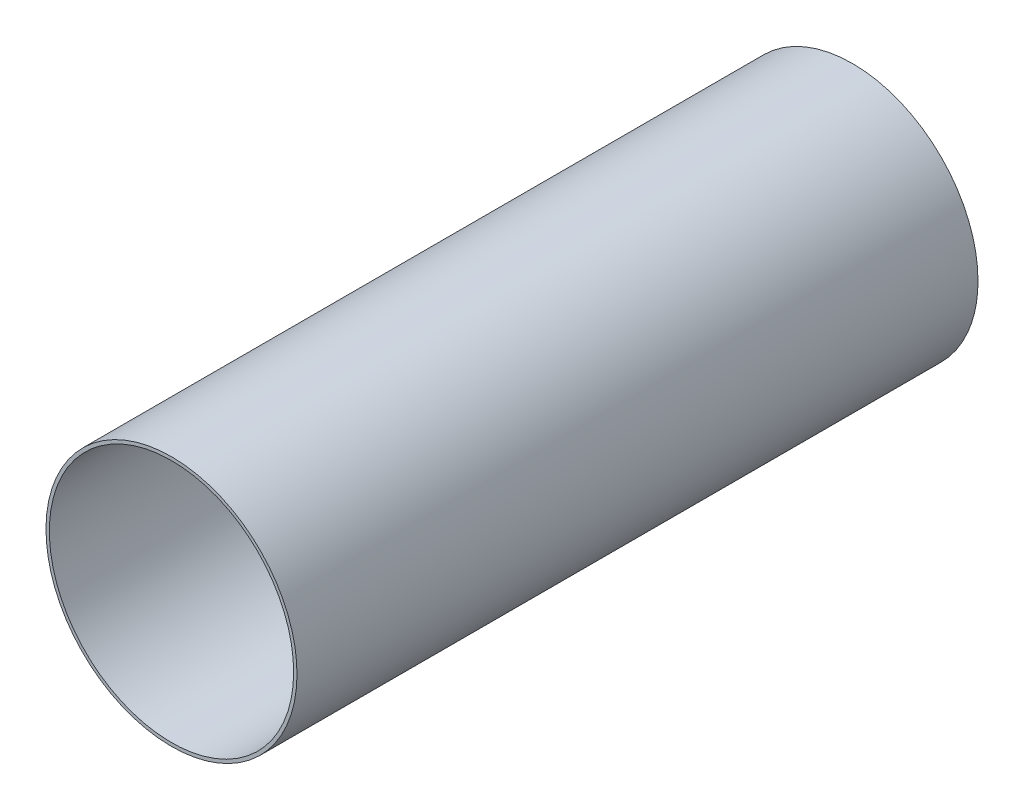
ISO-10303-21;
HEADER;
FILE_DESCRIPTION(('STEP AP214'),'2;1');
FILE_NAME('part.step','',(''),(''),'','','');
FILE_SCHEMA(('AUTOMOTIVE_DESIGN { 1 0 10303 214 1 1 1 1 }'));
ENDSEC;
DATA;
#1=APPLICATION_CONTEXT('core data for automotive mechanical design processes');
#2=APPLICATION_PROTOCOL_DEFINITION('international standard','automotive_design',2000,#1);
#3=PRODUCT_CONTEXT('',#1,'mechanical');
#4=PRODUCT('Part','Part','',(#3));
#5=PRODUCT_RELATED_PRODUCT_CATEGORY('part','',(#4));
#6=PRODUCT_DEFINITION_FORMATION('','',#4);
#7=PRODUCT_DEFINITION_CONTEXT('part definition',#1,'design');
#8=PRODUCT_DEFINITION('design','',#6,#7);
#9=PRODUCT_DEFINITION_SHAPE('','',#8);
#10=(LENGTH_UNIT() NAMED_UNIT(*) SI_UNIT(.MILLI.,.METRE.));
#11=(NAMED_UNIT(*) PLANE_ANGLE_UNIT() SI_UNIT($,.RADIAN.));
#12=(NAMED_UNIT(*) SI_UNIT($,.STERADIAN.) SOLID_ANGLE_UNIT());
#13=UNCERTAINTY_MEASURE_WITH_UNIT(LENGTH_MEASURE(1.E-05),#10,'distance_accuracy_value','');
#14=(GEOMETRIC_REPRESENTATION_CONTEXT(3) GLOBAL_UNCERTAINTY_ASSIGNED_CONTEXT((#13)) GLOBAL_UNIT_ASSIGNED_CONTEXT((#10,
#11,#12)) REPRESENTATION_CONTEXT('',''));
#15=CARTESIAN_POINT('',(0.,0.,0.));
#16=DIRECTION('',(0.,0.,1.));
#17=DIRECTION('',(1.,0.,0.));
#18=AXIS2_PLACEMENT_3D('',#15,#16,#17);
#19=CARTESIAN_POINT('',(0.,0.,0.));
#20=DIRECTION('',(0.,0.,1.));
#21=DIRECTION('',(1.,0.,0.));
#22=AXIS2_PLACEMENT_3D('',#19,#20,#21);
#23=PLANE('',#22);
#24=CARTESIAN_POINT('',(0.,0.,0.));
#25=DIRECTION('',(0.,0.,1.));
#26=DIRECTION('',(1.,0.,0.));
#27=AXIS2_PLACEMENT_3D('',#24,#25,#26);
#28=CIRCLE('',#27,75.);
#29=CARTESIAN_POINT('',(75.,0.,0.));
#30=VERTEX_POINT('',#29);
#31=EDGE_CURVE('E43',#30,#30,#28,.T.);
#32=ORIENTED_EDGE('',*,*,#31,.F.);
#33=EDGE_LOOP('',(#32));
#34=FACE_BOUND('',#33,.T.);
#35=CARTESIAN_POINT('',(0.,0.,0.));
#36=DIRECTION('',(0.,0.,1.));
#37=DIRECTION('',(1.,0.,0.));
#38=AXIS2_PLACEMENT_3D('',#35,#36,#37);
#39=CIRCLE('',#38,73.);
#40=CARTESIAN_POINT('',(73.,0.,0.));
#41=VERTEX_POINT('',#40);
#42=EDGE_CURVE('E53',#41,#41,#39,.T.);
#43=ORIENTED_EDGE('',*,*,#42,.T.);
#44=EDGE_LOOP('',(#43));
#45=FACE_BOUND('',#44,.T.);
#46=ADVANCED_FACE('F39',(#34,#45),#23,.F.);
#47=CARTESIAN_POINT('',(0.,0.,619.100505098061));
#48=DIRECTION('',(0.,0.,-1.));
#49=DIRECTION('',(-1.,0.,0.));
#50=AXIS2_PLACEMENT_3D('',#47,#48,#49);
#51=CYLINDRICAL_SURFACE('',#50,75.);
#52=CARTESIAN_POINT('',(-2.07860910810851E-09,2.78020886220942E-09,406.968470742096));
#53=DIRECTION('',(0.,0.,-1.));
#54=DIRECTION('',(0.918796115448513,-0.394732438794587,0.));
#55=AXIS2_PLACEMENT_3D('',#52,#53,#54);
#56=CIRCLE('',#55,75.);
#57=CARTESIAN_POINT('',(68.9097086565599,-29.6049329068138,406.968470742099));
#58=VERTEX_POINT('',#57);
#59=EDGE_CURVE('E47',#58,#58,#56,.T.);
#60=ORIENTED_EDGE('',*,*,#59,.T.);
#61=EDGE_LOOP('',(#60));
#62=FACE_BOUND('',#61,.T.);
#63=ORIENTED_EDGE('',*,*,#31,.T.);
#64=EDGE_LOOP('',(#63));
#65=FACE_BOUND('',#64,.T.);
#66=ADVANCED_FACE('F41',(#62,#65),#51,.T.);
#67=CARTESIAN_POINT('',(0.,0.,619.100505098061));
#68=DIRECTION('',(0.,0.,-1.));
#69=DIRECTION('',(-1.,0.,0.));
#70=AXIS2_PLACEMENT_3D('',#67,#68,#69);
#71=CYLINDRICAL_SURFACE('',#70,73.);
#72=CARTESIAN_POINT('',(-2.07860910810851E-09,2.78020886220942E-09,406.968470742096));
#73=DIRECTION('',(0.,0.,-1.));
#74=DIRECTION('',(0.918796115448513,-0.394732438794587,0.));
#75=AXIS2_PLACEMENT_3D('',#72,#73,#74);
#76=CIRCLE('',#75,73.);
#77=CARTESIAN_POINT('',(67.0721164256629,-28.8154680292246,406.968470742099));
#78=VERTEX_POINT('',#77);
#79=EDGE_CURVE('E11',#78,#78,#76,.T.);
#80=ORIENTED_EDGE('',*,*,#79,.F.);
#81=EDGE_LOOP('',(#80));
#82=FACE_BOUND('',#81,.T.);
#83=ORIENTED_EDGE('',*,*,#42,.F.);
#84=EDGE_LOOP('',(#83));
#85=FACE_BOUND('',#84,.T.);
#86=ADVANCED_FACE('F65',(#82,#85),#71,.F.);
#87=CARTESIAN_POINT('',(-2.07860910810851E-09,2.78020886220942E-09,406.968470742096));
#88=DIRECTION('',(0.,0.,-1.));
#89=DIRECTION('',(0.918796115448513,-0.394732438794587,0.));
#90=AXIS2_PLACEMENT_3D('',#87,#88,#89);
#91=PLANE('',#90);
#92=ORIENTED_EDGE('',*,*,#59,.F.);
#93=EDGE_LOOP('',(#92));
#94=FACE_BOUND('',#93,.T.);
#95=ORIENTED_EDGE('',*,*,#79,.T.);
#96=EDGE_LOOP('',(#95));
#97=FACE_BOUND('',#96,.T.);
#98=ADVANCED_FACE('F70',(#94,#97),#91,.F.);
#99=CLOSED_SHELL('',(#46,#66,#86,#98));
#100=MANIFOLD_SOLID_BREP('B2',#99);
#101=ADVANCED_BREP_SHAPE_REPRESENTATION('',(#18,#100),#14);
#102=SHAPE_DEFINITION_REPRESENTATION(#9,#101);
ENDSEC;
END-ISO-10303-21;
